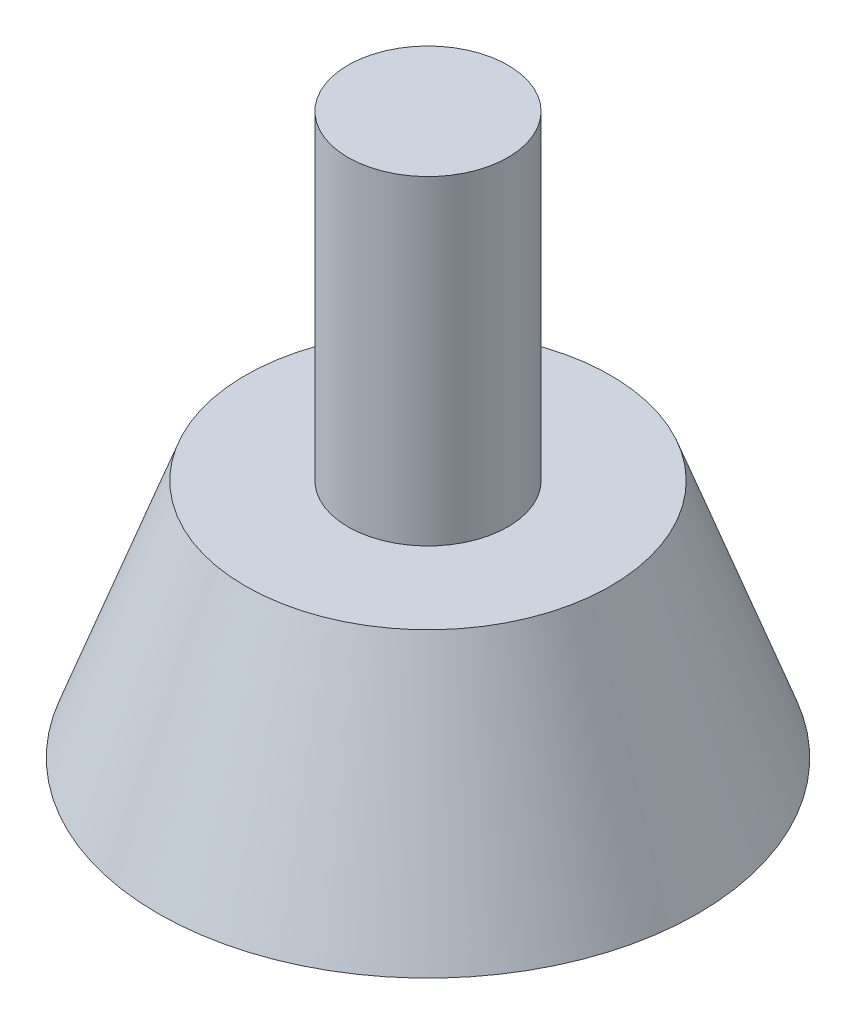
ISO-10303-21;
HEADER;
FILE_DESCRIPTION(('STEP AP214'),'2;1');
FILE_NAME('part.step','',(''),(''),'','','');
FILE_SCHEMA(('AUTOMOTIVE_DESIGN { 1 0 10303 214 1 1 1 1 }'));
ENDSEC;
DATA;
#1=APPLICATION_CONTEXT('core data for automotive mechanical design processes');
#2=APPLICATION_PROTOCOL_DEFINITION('international standard','automotive_design',2000,#1);
#3=PRODUCT_CONTEXT('',#1,'mechanical');
#4=PRODUCT('Part','Part','',(#3));
#5=PRODUCT_RELATED_PRODUCT_CATEGORY('part','',(#4));
#6=PRODUCT_DEFINITION_FORMATION('','',#4);
#7=PRODUCT_DEFINITION_CONTEXT('part definition',#1,'design');
#8=PRODUCT_DEFINITION('design','',#6,#7);
#9=PRODUCT_DEFINITION_SHAPE('','',#8);
#10=(LENGTH_UNIT() NAMED_UNIT(*) SI_UNIT(.MILLI.,.METRE.));
#11=(NAMED_UNIT(*) PLANE_ANGLE_UNIT() SI_UNIT($,.RADIAN.));
#12=(NAMED_UNIT(*) SI_UNIT($,.STERADIAN.) SOLID_ANGLE_UNIT());
#13=UNCERTAINTY_MEASURE_WITH_UNIT(LENGTH_MEASURE(1.E-05),#10,'distance_accuracy_value','');
#14=(GEOMETRIC_REPRESENTATION_CONTEXT(3) GLOBAL_UNCERTAINTY_ASSIGNED_CONTEXT((#13)) GLOBAL_UNIT_ASSIGNED_CONTEXT((#10,
#11,#12)) REPRESENTATION_CONTEXT('',''));
#15=CARTESIAN_POINT('',(0.,0.,0.));
#16=DIRECTION('',(0.,0.,1.));
#17=DIRECTION('',(1.,0.,0.));
#18=AXIS2_PLACEMENT_3D('',#15,#16,#17);
#19=CARTESIAN_POINT('',(0.,0.,0.));
#20=DIRECTION('',(0.,-1.,0.));
#21=DIRECTION('',(0.,0.,1.));
#22=AXIS2_PLACEMENT_3D('',#19,#20,#21);
#23=CONICAL_SURFACE('',#22,13.5,0.349065850398866);
#24=CARTESIAN_POINT('',(0.,12.,0.));
#25=DIRECTION('',(0.,1.,0.));
#26=DIRECTION('',(0.,0.,1.));
#27=AXIS2_PLACEMENT_3D('',#24,#25,#26);
#28=CIRCLE('',#27,9.13235718880557);
#29=CARTESIAN_POINT('',(0.,12.,9.13235718880557));
#30=VERTEX_POINT('',#29);
#31=EDGE_CURVE('E42',#30,#30,#28,.T.);
#32=ORIENTED_EDGE('',*,*,#31,.F.);
#33=EDGE_LOOP('',(#32));
#34=FACE_BOUND('',#33,.T.);
#35=CARTESIAN_POINT('',(0.,0.,0.));
#36=DIRECTION('',(0.,1.,0.));
#37=DIRECTION('',(0.,0.,1.));
#38=AXIS2_PLACEMENT_3D('',#35,#36,#37);
#39=CIRCLE('',#38,13.5);
#40=CARTESIAN_POINT('',(0.,0.,13.5));
#41=VERTEX_POINT('',#40);
#42=EDGE_CURVE('E50',#41,#41,#39,.T.);
#43=ORIENTED_EDGE('',*,*,#42,.T.);
#44=EDGE_LOOP('',(#43));
#45=FACE_BOUND('',#44,.T.);
#46=ADVANCED_FACE('F39',(#34,#45),#23,.T.);
#47=CARTESIAN_POINT('',(0.,12.,0.));
#48=DIRECTION('',(0.,1.,0.));
#49=DIRECTION('',(0.,0.,1.));
#50=AXIS2_PLACEMENT_3D('',#47,#48,#49);
#51=PLANE('',#50);
#52=CARTESIAN_POINT('',(0.,12.,0.));
#53=DIRECTION('',(0.,1.,0.));
#54=DIRECTION('',(0.,0.,1.));
#55=AXIS2_PLACEMENT_3D('',#52,#53,#54);
#56=CIRCLE('',#55,4.);
#57=CARTESIAN_POINT('',(0.,12.,4.));
#58=VERTEX_POINT('',#57);
#59=EDGE_CURVE('E10',#58,#58,#56,.T.);
#60=ORIENTED_EDGE('',*,*,#59,.F.);
#61=EDGE_LOOP('',(#60));
#62=FACE_BOUND('',#61,.T.);
#63=ORIENTED_EDGE('',*,*,#31,.T.);
#64=EDGE_LOOP('',(#63));
#65=FACE_BOUND('',#64,.T.);
#66=ADVANCED_FACE('F71',(#62,#65),#51,.T.);
#67=CARTESIAN_POINT('',(0.,0.,0.));
#68=DIRECTION('',(0.,1.,0.));
#69=DIRECTION('',(0.,0.,1.));
#70=AXIS2_PLACEMENT_3D('',#67,#68,#69);
#71=PLANE('',#70);
#72=ORIENTED_EDGE('',*,*,#42,.F.);
#73=EDGE_LOOP('',(#72));
#74=FACE_BOUND('',#73,.T.);
#75=ADVANCED_FACE('F63',(#74),#71,.F.);
#76=CARTESIAN_POINT('',(0.,28.,0.));
#77=DIRECTION('',(0.,-1.,0.));
#78=DIRECTION('',(0.,0.,-1.));
#79=AXIS2_PLACEMENT_3D('',#76,#77,#78);
#80=CYLINDRICAL_SURFACE('',#79,4.);
#81=CARTESIAN_POINT('',(0.,28.,0.));
#82=DIRECTION('',(0.,1.,0.));
#83=DIRECTION('',(0.,0.,1.));
#84=AXIS2_PLACEMENT_3D('',#81,#82,#83);
#85=CIRCLE('',#84,4.);
#86=CARTESIAN_POINT('',(0.,28.,4.));
#87=VERTEX_POINT('',#86);
#88=EDGE_CURVE('E52',#87,#87,#85,.T.);
#89=ORIENTED_EDGE('',*,*,#88,.F.);
#90=EDGE_LOOP('',(#89));
#91=FACE_BOUND('',#90,.T.);
#92=ORIENTED_EDGE('',*,*,#59,.T.);
#93=EDGE_LOOP('',(#92));
#94=FACE_BOUND('',#93,.T.);
#95=ADVANCED_FACE('F61',(#91,#94),#80,.T.);
#96=CARTESIAN_POINT('',(0.,28.,0.));
#97=DIRECTION('',(0.,1.,0.));
#98=DIRECTION('',(0.,0.,1.));
#99=AXIS2_PLACEMENT_3D('',#96,#97,#98);
#100=PLANE('',#99);
#101=ORIENTED_EDGE('',*,*,#88,.T.);
#102=EDGE_LOOP('',(#101));
#103=FACE_BOUND('',#102,.T.);
#104=ADVANCED_FACE('F59',(#103),#100,.T.);
#105=CLOSED_SHELL('',(#46,#66,#75,#95,#104));
#106=MANIFOLD_SOLID_BREP('B2',#105);
#107=ADVANCED_BREP_SHAPE_REPRESENTATION('',(#18,#106),#14);
#108=SHAPE_DEFINITION_REPRESENTATION(#9,#107);
ENDSEC;
END-ISO-10303-21;
